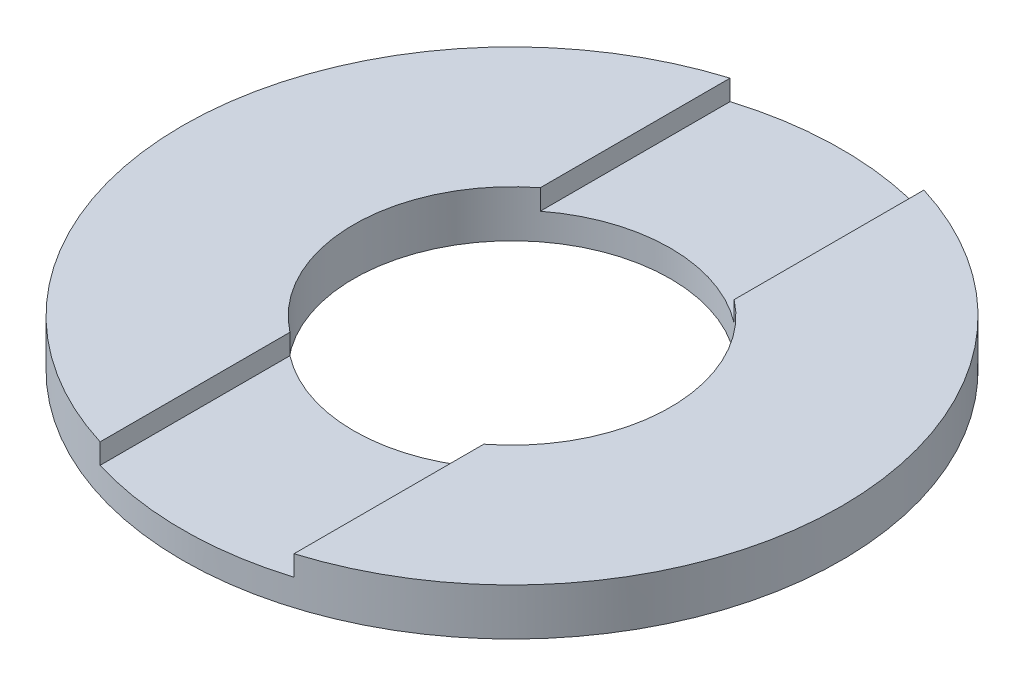
ISO-10303-21;
HEADER;
FILE_DESCRIPTION(('STEP AP214'),'2;1');
FILE_NAME('part.step','',(''),(''),'','','');
FILE_SCHEMA(('AUTOMOTIVE_DESIGN { 1 0 10303 214 1 1 1 1 }'));
ENDSEC;
DATA;
#1=APPLICATION_CONTEXT('core data for automotive mechanical design processes');
#2=APPLICATION_PROTOCOL_DEFINITION('international standard','automotive_design',2000,#1);
#3=PRODUCT_CONTEXT('',#1,'mechanical');
#4=PRODUCT('Part','Part','',(#3));
#5=PRODUCT_RELATED_PRODUCT_CATEGORY('part','',(#4));
#6=PRODUCT_DEFINITION_FORMATION('','',#4);
#7=PRODUCT_DEFINITION_CONTEXT('part definition',#1,'design');
#8=PRODUCT_DEFINITION('design','',#6,#7);
#9=PRODUCT_DEFINITION_SHAPE('','',#8);
#10=(LENGTH_UNIT() NAMED_UNIT(*) SI_UNIT(.MILLI.,.METRE.));
#11=(NAMED_UNIT(*) PLANE_ANGLE_UNIT() SI_UNIT($,.RADIAN.));
#12=(NAMED_UNIT(*) SI_UNIT($,.STERADIAN.) SOLID_ANGLE_UNIT());
#13=UNCERTAINTY_MEASURE_WITH_UNIT(LENGTH_MEASURE(1.E-05),#10,'distance_accuracy_value','');
#14=(GEOMETRIC_REPRESENTATION_CONTEXT(3) GLOBAL_UNCERTAINTY_ASSIGNED_CONTEXT((#13)) GLOBAL_UNIT_ASSIGNED_CONTEXT((#10,
#11,#12)) REPRESENTATION_CONTEXT('',''));
#15=CARTESIAN_POINT('',(0.,0.,0.));
#16=DIRECTION('',(0.,0.,1.));
#17=DIRECTION('',(1.,0.,0.));
#18=AXIS2_PLACEMENT_3D('',#15,#16,#17);
#19=CARTESIAN_POINT('',(0.,2.9,0.));
#20=DIRECTION('',(0.,1.,0.));
#21=DIRECTION('',(0.,0.,1.));
#22=AXIS2_PLACEMENT_3D('',#19,#20,#21);
#23=PLANE('',#22);
#24=CARTESIAN_POINT('',(0.,2.9,0.));
#25=DIRECTION('',(0.,1.,0.));
#26=DIRECTION('',(0.,0.,1.));
#27=AXIS2_PLACEMENT_3D('',#24,#25,#26);
#28=CIRCLE('',#27,20.4);
#29=CARTESIAN_POINT('',(-6.,2.9,19.4976921711263));
#30=VERTEX_POINT('',#29);
#31=CARTESIAN_POINT('',(-6.,2.9,-19.4976921711263));
#32=VERTEX_POINT('',#31);
#33=EDGE_CURVE('E144',#30,#32,#28,.F.);
#34=ORIENTED_EDGE('',*,*,#33,.F.);
#35=DIRECTION('',(0.,0.,1.));
#36=VECTOR('',#35,1.);
#37=CARTESIAN_POINT('',(-6.,2.9,43.9268832717572));
#38=LINE('',#37,#36);
#39=CARTESIAN_POINT('',(-6.,2.9,7.74854825112421));
#40=VERTEX_POINT('',#39);
#41=EDGE_CURVE('E106',#40,#30,#38,.T.);
#42=ORIENTED_EDGE('',*,*,#41,.F.);
#43=CARTESIAN_POINT('',(0.,2.9,0.));
#44=DIRECTION('',(0.,1.,0.));
#45=DIRECTION('',(0.,0.,1.));
#46=AXIS2_PLACEMENT_3D('',#43,#44,#45);
#47=CIRCLE('',#46,9.8);
#48=CARTESIAN_POINT('',(-6.,2.9,-7.74854825112421));
#49=VERTEX_POINT('',#48);
#50=EDGE_CURVE('E126',#40,#49,#47,.F.);
#51=ORIENTED_EDGE('',*,*,#50,.T.);
#52=EDGE_CURVE('E125',#32,#49,#38,.T.);
#53=ORIENTED_EDGE('',*,*,#52,.F.);
#54=EDGE_LOOP('',(#34,#42,#51,#53));
#55=FACE_BOUND('',#54,.T.);
#56=ADVANCED_FACE('F32',(#55),#23,.T.);
#57=CARTESIAN_POINT('',(0.,2.9,0.));
#58=DIRECTION('',(0.,1.,0.));
#59=DIRECTION('',(0.,0.,1.));
#60=AXIS2_PLACEMENT_3D('',#57,#58,#59);
#61=CIRCLE('',#60,20.4);
#62=CARTESIAN_POINT('',(6.,2.9,-19.4976921711263));
#63=VERTEX_POINT('',#62);
#64=CARTESIAN_POINT('',(6.,2.9,19.4976921711263));
#65=VERTEX_POINT('',#64);
#66=EDGE_CURVE('E107',#63,#65,#61,.F.);
#67=ORIENTED_EDGE('',*,*,#66,.F.);
#68=DIRECTION('',(0.,0.,-1.));
#69=VECTOR('',#68,1.);
#70=CARTESIAN_POINT('',(6.,2.9,0.));
#71=LINE('',#70,#69);
#72=CARTESIAN_POINT('',(6.,2.9,-7.74854825112421));
#73=VERTEX_POINT('',#72);
#74=EDGE_CURVE('E119',#73,#63,#71,.T.);
#75=ORIENTED_EDGE('',*,*,#74,.F.);
#76=CARTESIAN_POINT('',(6.,2.9,7.74854825112421));
#77=VERTEX_POINT('',#76);
#78=EDGE_CURVE('E130',#73,#77,#47,.F.);
#79=ORIENTED_EDGE('',*,*,#78,.T.);
#80=EDGE_CURVE('E122',#65,#77,#71,.T.);
#81=ORIENTED_EDGE('',*,*,#80,.F.);
#82=EDGE_LOOP('',(#67,#75,#79,#81));
#83=FACE_BOUND('',#82,.T.);
#84=ADVANCED_FACE('F172',(#83),#23,.T.);
#85=CARTESIAN_POINT('',(0.,0.,0.));
#86=DIRECTION('',(0.,1.,0.));
#87=DIRECTION('',(0.,0.,1.));
#88=AXIS2_PLACEMENT_3D('',#85,#86,#87);
#89=PLANE('',#88);
#90=CARTESIAN_POINT('',(0.,0.,0.));
#91=DIRECTION('',(0.,1.,0.));
#92=DIRECTION('',(0.,0.,1.));
#93=AXIS2_PLACEMENT_3D('',#90,#91,#92);
#94=CIRCLE('',#93,9.8);
#95=CARTESIAN_POINT('',(0.,0.,9.8));
#96=VERTEX_POINT('',#95);
#97=EDGE_CURVE('E114',#96,#96,#94,.F.);
#98=ORIENTED_EDGE('',*,*,#97,.F.);
#99=EDGE_LOOP('',(#98));
#100=FACE_BOUND('',#99,.T.);
#101=CARTESIAN_POINT('',(0.,0.,0.));
#102=DIRECTION('',(0.,1.,0.));
#103=DIRECTION('',(0.,0.,1.));
#104=AXIS2_PLACEMENT_3D('',#101,#102,#103);
#105=CIRCLE('',#104,20.4);
#106=CARTESIAN_POINT('',(0.,0.,20.4));
#107=VERTEX_POINT('',#106);
#108=EDGE_CURVE('E123',#107,#107,#105,.F.);
#109=ORIENTED_EDGE('',*,*,#108,.T.);
#110=EDGE_LOOP('',(#109));
#111=FACE_BOUND('',#110,.T.);
#112=ADVANCED_FACE('F34',(#100,#111),#89,.F.);
#113=CARTESIAN_POINT('',(0.,1.64,0.));
#114=DIRECTION('',(0.,-1.,0.));
#115=DIRECTION('',(0.,0.,-1.));
#116=AXIS2_PLACEMENT_3D('',#113,#114,#115);
#117=PLANE('',#116);
#118=DIRECTION('',(0.,0.,-1.));
#119=VECTOR('',#118,1.);
#120=CARTESIAN_POINT('',(6.,1.64,0.));
#121=LINE('',#120,#119);
#122=CARTESIAN_POINT('',(6.,1.64,-7.74854825112421));
#123=VERTEX_POINT('',#122);
#124=CARTESIAN_POINT('',(6.,1.64,-19.4976921711263));
#125=VERTEX_POINT('',#124);
#126=EDGE_CURVE('E115',#123,#125,#121,.T.);
#127=ORIENTED_EDGE('',*,*,#126,.T.);
#128=CARTESIAN_POINT('',(0.,1.64,0.));
#129=DIRECTION('',(0.,-1.,0.));
#130=DIRECTION('',(0.,0.,-1.));
#131=AXIS2_PLACEMENT_3D('',#128,#129,#130);
#132=CIRCLE('',#131,20.4);
#133=CARTESIAN_POINT('',(-6.,1.64,-19.4976921711263));
#134=VERTEX_POINT('',#133);
#135=EDGE_CURVE('E160',#125,#134,#132,.F.);
#136=ORIENTED_EDGE('',*,*,#135,.T.);
#137=DIRECTION('',(0.,0.,1.));
#138=VECTOR('',#137,1.);
#139=CARTESIAN_POINT('',(-6.,1.64,0.));
#140=LINE('',#139,#138);
#141=CARTESIAN_POINT('',(-6.,1.64,-7.74854825112421));
#142=VERTEX_POINT('',#141);
#143=EDGE_CURVE('E112',#134,#142,#140,.T.);
#144=ORIENTED_EDGE('',*,*,#143,.T.);
#145=CARTESIAN_POINT('',(0.,1.64,0.));
#146=DIRECTION('',(0.,-1.,0.));
#147=DIRECTION('',(0.,0.,-1.));
#148=AXIS2_PLACEMENT_3D('',#145,#146,#147);
#149=CIRCLE('',#148,9.8);
#150=EDGE_CURVE('E129',#142,#123,#149,.T.);
#151=ORIENTED_EDGE('',*,*,#150,.T.);
#152=EDGE_LOOP('',(#127,#136,#144,#151));
#153=FACE_BOUND('',#152,.T.);
#154=ADVANCED_FACE('F159',(#153),#117,.F.);
#155=CARTESIAN_POINT('',(-6.,1.64,7.74854825112421));
#156=VERTEX_POINT('',#155);
#157=CARTESIAN_POINT('',(-6.,1.64,19.4976921711263));
#158=VERTEX_POINT('',#157);
#159=EDGE_CURVE('E103',#156,#158,#140,.T.);
#160=ORIENTED_EDGE('',*,*,#159,.T.);
#161=CARTESIAN_POINT('',(0.,1.64,0.));
#162=DIRECTION('',(0.,-1.,0.));
#163=DIRECTION('',(0.,0.,-1.));
#164=AXIS2_PLACEMENT_3D('',#161,#162,#163);
#165=CIRCLE('',#164,20.4);
#166=CARTESIAN_POINT('',(6.,1.64,19.4976921711263));
#167=VERTEX_POINT('',#166);
#168=EDGE_CURVE('E11',#158,#167,#165,.F.);
#169=ORIENTED_EDGE('',*,*,#168,.T.);
#170=CARTESIAN_POINT('',(6.,1.64,7.74854825112421));
#171=VERTEX_POINT('',#170);
#172=EDGE_CURVE('E53',#167,#171,#121,.T.);
#173=ORIENTED_EDGE('',*,*,#172,.T.);
#174=EDGE_CURVE('E111',#171,#156,#149,.T.);
#175=ORIENTED_EDGE('',*,*,#174,.T.);
#176=EDGE_LOOP('',(#160,#169,#173,#175));
#177=FACE_BOUND('',#176,.T.);
#178=ADVANCED_FACE('F109',(#177),#117,.F.);
#179=CARTESIAN_POINT('',(0.,18.9,0.));
#180=DIRECTION('',(0.,-1.,0.));
#181=DIRECTION('',(0.,0.,-1.));
#182=AXIS2_PLACEMENT_3D('',#179,#180,#181);
#183=CYLINDRICAL_SURFACE('',#182,9.8);
#184=DIRECTION('',(0.,-1.,0.));
#185=VECTOR('',#184,1.);
#186=CARTESIAN_POINT('',(-6.,18.9,7.74854825112421));
#187=LINE('',#186,#185);
#188=EDGE_CURVE('E40',#156,#40,#187,.F.);
#189=ORIENTED_EDGE('',*,*,#188,.F.);
#190=ORIENTED_EDGE('',*,*,#174,.F.);
#191=DIRECTION('',(0.,-1.,0.));
#192=VECTOR('',#191,1.);
#193=CARTESIAN_POINT('',(6.,18.9,7.74854825112421));
#194=LINE('',#193,#192);
#195=EDGE_CURVE('E139',#77,#171,#194,.T.);
#196=ORIENTED_EDGE('',*,*,#195,.F.);
#197=ORIENTED_EDGE('',*,*,#78,.F.);
#198=DIRECTION('',(0.,-1.,0.));
#199=VECTOR('',#198,1.);
#200=CARTESIAN_POINT('',(6.,18.9,-7.74854825112421));
#201=LINE('',#200,#199);
#202=EDGE_CURVE('E134',#123,#73,#201,.F.);
#203=ORIENTED_EDGE('',*,*,#202,.F.);
#204=ORIENTED_EDGE('',*,*,#150,.F.);
#205=DIRECTION('',(0.,-1.,0.));
#206=VECTOR('',#205,1.);
#207=CARTESIAN_POINT('',(-6.,18.9,-7.74854825112421));
#208=LINE('',#207,#206);
#209=EDGE_CURVE('E136',#49,#142,#208,.T.);
#210=ORIENTED_EDGE('',*,*,#209,.F.);
#211=ORIENTED_EDGE('',*,*,#50,.F.);
#212=EDGE_LOOP('',(#189,#190,#196,#197,#203,#204,#210,#211));
#213=FACE_BOUND('',#212,.T.);
#214=ORIENTED_EDGE('',*,*,#97,.T.);
#215=EDGE_LOOP('',(#214));
#216=FACE_BOUND('',#215,.T.);
#217=ADVANCED_FACE('F146',(#213,#216),#183,.F.);
#218=CARTESIAN_POINT('',(6.,1.64,0.));
#219=DIRECTION('',(1.,0.,0.));
#220=DIRECTION('',(0.,0.,-1.));
#221=AXIS2_PLACEMENT_3D('',#218,#219,#220);
#222=PLANE('',#221);
#223=ORIENTED_EDGE('',*,*,#74,.T.);
#224=DIRECTION('',(0.,-1.,0.));
#225=VECTOR('',#224,1.);
#226=CARTESIAN_POINT('',(6.,23.9,-19.4976921711263));
#227=LINE('',#226,#225);
#228=EDGE_CURVE('E165',#63,#125,#227,.T.);
#229=ORIENTED_EDGE('',*,*,#228,.T.);
#230=ORIENTED_EDGE('',*,*,#126,.F.);
#231=ORIENTED_EDGE('',*,*,#202,.T.);
#232=EDGE_LOOP('',(#223,#229,#230,#231));
#233=FACE_BOUND('',#232,.T.);
#234=ADVANCED_FACE('F163',(#233),#222,.F.);
#235=CARTESIAN_POINT('',(-6.,1.64,43.9268832717572));
#236=DIRECTION('',(-1.,0.,0.));
#237=DIRECTION('',(0.,0.,1.));
#238=AXIS2_PLACEMENT_3D('',#235,#236,#237);
#239=PLANE('',#238);
#240=ORIENTED_EDGE('',*,*,#143,.F.);
#241=DIRECTION('',(0.,-1.,0.));
#242=VECTOR('',#241,1.);
#243=CARTESIAN_POINT('',(-6.,23.9,-19.4976921711263));
#244=LINE('',#243,#242);
#245=EDGE_CURVE('E154',#134,#32,#244,.F.);
#246=ORIENTED_EDGE('',*,*,#245,.T.);
#247=ORIENTED_EDGE('',*,*,#52,.T.);
#248=ORIENTED_EDGE('',*,*,#209,.T.);
#249=EDGE_LOOP('',(#240,#246,#247,#248));
#250=FACE_BOUND('',#249,.T.);
#251=ADVANCED_FACE('F152',(#250),#239,.F.);
#252=ORIENTED_EDGE('',*,*,#41,.T.);
#253=DIRECTION('',(0.,-1.,0.));
#254=VECTOR('',#253,1.);
#255=CARTESIAN_POINT('',(-6.,23.9,19.4976921711263));
#256=LINE('',#255,#254);
#257=EDGE_CURVE('E96',#30,#158,#256,.T.);
#258=ORIENTED_EDGE('',*,*,#257,.T.);
#259=ORIENTED_EDGE('',*,*,#159,.F.);
#260=ORIENTED_EDGE('',*,*,#188,.T.);
#261=EDGE_LOOP('',(#252,#258,#259,#260));
#262=FACE_BOUND('',#261,.T.);
#263=ADVANCED_FACE('F102',(#262),#239,.F.);
#264=ORIENTED_EDGE('',*,*,#172,.F.);
#265=DIRECTION('',(0.,-1.,0.));
#266=VECTOR('',#265,1.);
#267=CARTESIAN_POINT('',(6.,23.9,19.4976921711263));
#268=LINE('',#267,#266);
#269=EDGE_CURVE('E47',#167,#65,#268,.F.);
#270=ORIENTED_EDGE('',*,*,#269,.T.);
#271=ORIENTED_EDGE('',*,*,#80,.T.);
#272=ORIENTED_EDGE('',*,*,#195,.T.);
#273=EDGE_LOOP('',(#264,#270,#271,#272));
#274=FACE_BOUND('',#273,.T.);
#275=ADVANCED_FACE('F183',(#274),#222,.F.);
#276=CARTESIAN_POINT('',(0.,23.9,0.));
#277=DIRECTION('',(0.,-1.,0.));
#278=DIRECTION('',(0.,0.,-1.));
#279=AXIS2_PLACEMENT_3D('',#276,#277,#278);
#280=CYLINDRICAL_SURFACE('',#279,20.4);
#281=ORIENTED_EDGE('',*,*,#228,.F.);
#282=ORIENTED_EDGE('',*,*,#66,.T.);
#283=ORIENTED_EDGE('',*,*,#269,.F.);
#284=ORIENTED_EDGE('',*,*,#168,.F.);
#285=ORIENTED_EDGE('',*,*,#257,.F.);
#286=ORIENTED_EDGE('',*,*,#33,.T.);
#287=ORIENTED_EDGE('',*,*,#245,.F.);
#288=ORIENTED_EDGE('',*,*,#135,.F.);
#289=EDGE_LOOP('',(#281,#282,#283,#284,#285,#286,#287,#288));
#290=FACE_BOUND('',#289,.T.);
#291=ORIENTED_EDGE('',*,*,#108,.F.);
#292=EDGE_LOOP('',(#291));
#293=FACE_BOUND('',#292,.T.);
#294=ADVANCED_FACE('F94',(#290,#293),#280,.T.);
#295=CLOSED_SHELL('',(#56,#84,#112,#154,#178,#217,#234,#251,#263,#275,#294));
#296=MANIFOLD_SOLID_BREP('B2',#295);
#297=ADVANCED_BREP_SHAPE_REPRESENTATION('',(#18,#296),#14);
#298=SHAPE_DEFINITION_REPRESENTATION(#9,#297);
ENDSEC;
END-ISO-10303-21;
